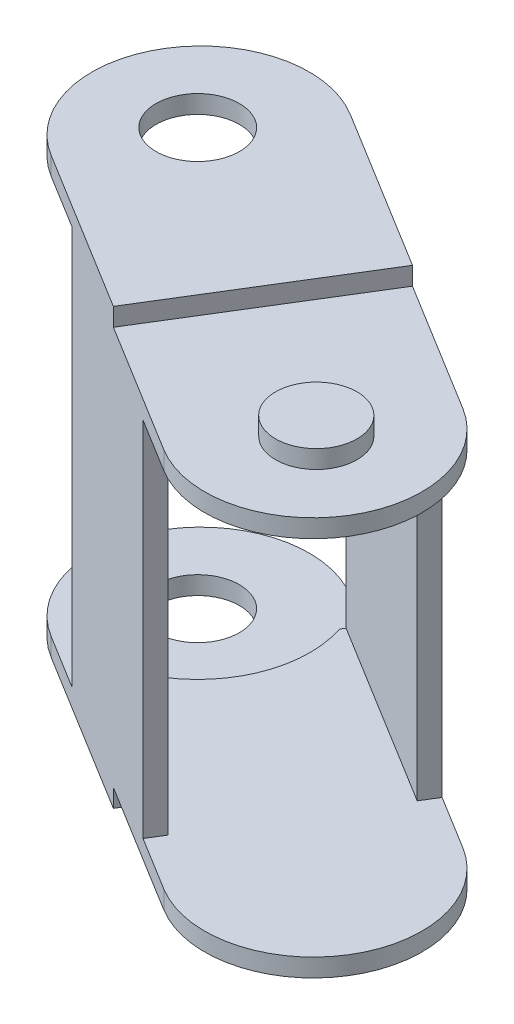
ISO-10303-21;
HEADER;
FILE_DESCRIPTION(('STEP AP214'),'2;1');
FILE_NAME('part.step','',(''),(''),'','','');
FILE_SCHEMA(('AUTOMOTIVE_DESIGN { 1 0 10303 214 1 1 1 1 }'));
ENDSEC;
DATA;
#1=APPLICATION_CONTEXT('core data for automotive mechanical design processes');
#2=APPLICATION_PROTOCOL_DEFINITION('international standard','automotive_design',2000,#1);
#3=PRODUCT_CONTEXT('',#1,'mechanical');
#4=PRODUCT('Part','Part','',(#3));
#5=PRODUCT_RELATED_PRODUCT_CATEGORY('part','',(#4));
#6=PRODUCT_DEFINITION_FORMATION('','',#4);
#7=PRODUCT_DEFINITION_CONTEXT('part definition',#1,'design');
#8=PRODUCT_DEFINITION('design','',#6,#7);
#9=PRODUCT_DEFINITION_SHAPE('','',#8);
#10=(LENGTH_UNIT() NAMED_UNIT(*) SI_UNIT(.MILLI.,.METRE.));
#11=(NAMED_UNIT(*) PLANE_ANGLE_UNIT() SI_UNIT($,.RADIAN.));
#12=(NAMED_UNIT(*) SI_UNIT($,.STERADIAN.) SOLID_ANGLE_UNIT());
#13=UNCERTAINTY_MEASURE_WITH_UNIT(LENGTH_MEASURE(1.E-05),#10,'distance_accuracy_value','');
#14=(GEOMETRIC_REPRESENTATION_CONTEXT(3) GLOBAL_UNCERTAINTY_ASSIGNED_CONTEXT((#13)) GLOBAL_UNIT_ASSIGNED_CONTEXT((#10,
#11,#12)) REPRESENTATION_CONTEXT('',''));
#15=CARTESIAN_POINT('',(0.,0.,0.));
#16=DIRECTION('',(0.,0.,1.));
#17=DIRECTION('',(1.,0.,0.));
#18=AXIS2_PLACEMENT_3D('',#15,#16,#17);
#19=CARTESIAN_POINT('',(-542.9529281263,21.5,74.6286141701));
#20=DIRECTION('',(0.,1.,0.));
#21=DIRECTION('',(0.851554736969907,0.,0.524265705481593));
#22=AXIS2_PLACEMENT_3D('',#19,#20,#21);
#23=CYLINDRICAL_SURFACE('',#22,2.25);
#24=CARTESIAN_POINT('',(-542.9529281263,21.,74.6286141701));
#25=DIRECTION('',(0.,1.,0.));
#26=DIRECTION('',(0.85155473696992,0.,0.524265705481572));
#27=AXIS2_PLACEMENT_3D('',#24,#25,#26);
#28=CIRCLE('',#27,2.25);
#29=CARTESIAN_POINT('',(-541.036929968118,21.,75.8082120074335));
#30=VERTEX_POINT('',#29);
#31=EDGE_CURVE('E205',#30,#30,#28,.F.);
#32=ORIENTED_EDGE('',*,*,#31,.F.);
#33=EDGE_LOOP('',(#32));
#34=FACE_BOUND('',#33,.T.);
#35=CARTESIAN_POINT('',(-542.9529281263,22.,74.6286141701));
#36=DIRECTION('',(0.,-1.,0.));
#37=DIRECTION('',(-0.85155473696992,0.,-0.524265705481572));
#38=AXIS2_PLACEMENT_3D('',#35,#36,#37);
#39=CIRCLE('',#38,2.25);
#40=CARTESIAN_POINT('',(-544.868926284482,22.,73.4490163327665));
#41=VERTEX_POINT('',#40);
#42=EDGE_CURVE('E202',#41,#41,#39,.F.);
#43=ORIENTED_EDGE('',*,*,#42,.F.);
#44=EDGE_LOOP('',(#43));
#45=FACE_BOUND('',#44,.T.);
#46=ADVANCED_FACE('F17',(#34,#45),#23,.T.);
#47=CARTESIAN_POINT('',(-547.471326526122,21.,64.80089439866));
#48=DIRECTION('',(0.,1.,0.));
#49=DIRECTION('',(-0.524265705481499,0.,0.851554736969965));
#50=AXIS2_PLACEMENT_3D('',#47,#48,#49);
#51=PLANE('',#50);
#52=CARTESIAN_POINT('',(-543.378705494923,21.,74.366481317392));
#53=DIRECTION('',(0.,1.,0.));
#54=DIRECTION('',(0.851554736978753,0.,0.524265705467226));
#55=AXIS2_PLACEMENT_3D('',#52,#53,#54);
#56=CIRCLE('',#55,6.);
#57=CARTESIAN_POINT('',(-540.233111262012,21.,69.257152895585));
#58=VERTEX_POINT('',#57);
#59=CARTESIAN_POINT('',(-546.524299727748,21.,79.475809739117));
#60=VERTEX_POINT('',#59);
#61=EDGE_CURVE('E189',#58,#60,#56,.F.);
#62=ORIENTED_EDGE('',*,*,#61,.F.);
#63=DIRECTION('',(-0.851554736962008,0.,-0.524265705494424));
#64=VECTOR('',#63,1.);
#65=CARTESIAN_POINT('',(-540.233111262006,21.,69.257152895576));
#66=LINE('',#65,#64);
#67=CARTESIAN_POINT('',(-547.471326526234,21.,64.800894398842));
#68=VERTEX_POINT('',#67);
#69=EDGE_CURVE('E177',#68,#58,#66,.F.);
#70=ORIENTED_EDGE('',*,*,#69,.F.);
#71=DIRECTION('',(-0.524265705481501,0.,0.851554736969963));
#72=VECTOR('',#71,1.);
#73=CARTESIAN_POINT('',(-547.471326526234,21.,64.800894398842));
#74=LINE('',#73,#72);
#75=CARTESIAN_POINT('',(-553.762514991925,21.,75.01955124234));
#76=VERTEX_POINT('',#75);
#77=EDGE_CURVE('E188',#76,#68,#74,.F.);
#78=ORIENTED_EDGE('',*,*,#77,.F.);
#79=DIRECTION('',(0.851554736958056,0.,0.524265705500843));
#80=VECTOR('',#79,1.);
#81=CARTESIAN_POINT('',(-553.762514991925,21.,75.01955124234));
#82=LINE('',#81,#80);
#83=EDGE_CURVE('E201',#60,#76,#82,.F.);
#84=ORIENTED_EDGE('',*,*,#83,.F.);
#85=EDGE_LOOP('',(#62,#70,#78,#84));
#86=FACE_BOUND('',#85,.T.);
#87=ORIENTED_EDGE('',*,*,#31,.T.);
#88=EDGE_LOOP('',(#87));
#89=FACE_BOUND('',#88,.T.);
#90=ADVANCED_FACE('F199',(#86,#89),#51,.T.);
#91=CARTESIAN_POINT('',(-546.080085144941,22.,75.416278455891));
#92=DIRECTION('',(0.,1.,0.));
#93=DIRECTION('',(0.851554736969965,0.,0.524265705481499));
#94=AXIS2_PLACEMENT_3D('',#91,#92,#93);
#95=PLANE('',#94);
#96=ORIENTED_EDGE('',*,*,#42,.T.);
#97=EDGE_LOOP('',(#96));
#98=FACE_BOUND('',#97,.T.);
#99=ADVANCED_FACE('F629',(#98),#95,.T.);
#100=CARTESIAN_POINT('',(-543.378705494818,-2.,74.366481317222));
#101=DIRECTION('',(0.,1.,0.));
#102=DIRECTION('',(-0.524265705480852,0.,0.851554736970363));
#103=AXIS2_PLACEMENT_3D('',#100,#101,#102);
#104=CYLINDRICAL_SURFACE('',#103,6.);
#105=DIRECTION('',(1.7735E-11,-1.,1.0914E-11));
#106=VECTOR('',#105,1.);
#107=CARTESIAN_POINT('',(-546.524299727703,21.,79.475809739044));
#108=LINE('',#107,#106);
#109=CARTESIAN_POINT('',(-546.524299727685,20.,79.475809739055));
#110=VERTEX_POINT('',#109);
#111=EDGE_CURVE('E217',#110,#60,#108,.F.);
#112=ORIENTED_EDGE('',*,*,#111,.F.);
#113=CARTESIAN_POINT('',(-543.378705494818,20.,74.366481317222));
#114=DIRECTION('',(0.,1.,0.));
#115=DIRECTION('',(-0.52426570547789,0.,0.851554736972187));
#116=AXIS2_PLACEMENT_3D('',#113,#114,#115);
#117=CIRCLE('',#116,6.);
#118=CARTESIAN_POINT('',(-540.233111262026,20.,69.257152895577));
#119=VERTEX_POINT('',#118);
#120=EDGE_CURVE('E196',#110,#119,#117,.T.);
#121=ORIENTED_EDGE('',*,*,#120,.T.);
#122=DIRECTION('',(1.3529E-11,1.,8.313E-12));
#123=VECTOR('',#122,1.);
#124=CARTESIAN_POINT('',(-540.233111262026,20.,69.257152895577));
#125=LINE('',#124,#123);
#126=EDGE_CURVE('E181',#119,#58,#125,.T.);
#127=ORIENTED_EDGE('',*,*,#126,.T.);
#128=ORIENTED_EDGE('',*,*,#61,.T.);
#129=EDGE_LOOP('',(#112,#121,#127,#128));
#130=FACE_BOUND('',#129,.T.);
#131=ADVANCED_FACE('F195',(#130),#104,.T.);
#132=CARTESIAN_POINT('',(-540.233111261896,-2.,69.25715289554));
#133=DIRECTION('',(0.524265705481499,0.,-0.851554736969965));
#134=DIRECTION('',(-0.851554736969965,0.,-0.524265705481499));
#135=AXIS2_PLACEMENT_3D('',#132,#133,#134);
#136=PLANE('',#135);
#137=DIRECTION('',(0.,-1.,0.));
#138=VECTOR('',#137,1.);
#139=CARTESIAN_POINT('',(-547.471326526255,22.,64.800894398877));
#140=LINE('',#139,#138);
#141=CARTESIAN_POINT('',(-547.471326526255,22.,64.800894398877));
#142=VERTEX_POINT('',#141);
#143=EDGE_CURVE('E184',#142,#68,#140,.T.);
#144=ORIENTED_EDGE('',*,*,#143,.T.);
#145=ORIENTED_EDGE('',*,*,#69,.T.);
#146=ORIENTED_EDGE('',*,*,#126,.F.);
#147=DIRECTION('',(-0.851554736969965,0.,-0.524265705481499));
#148=VECTOR('',#147,1.);
#149=CARTESIAN_POINT('',(-540.233111261973,20.,69.257152895492));
#150=LINE('',#149,#148);
#151=CARTESIAN_POINT('',(-543.2135528414,20.,67.422222926287));
#152=VERTEX_POINT('',#151);
#153=EDGE_CURVE('E229',#119,#152,#150,.T.);
#154=ORIENTED_EDGE('',*,*,#153,.T.);
#155=DIRECTION('',(0.,-1.,0.));
#156=VECTOR('',#155,1.);
#157=CARTESIAN_POINT('',(-543.2135528414,20.,67.422222926287));
#158=LINE('',#157,#156);
#159=CARTESIAN_POINT('',(-543.2135528414,0.,67.422222926287));
#160=VERTEX_POINT('',#159);
#161=EDGE_CURVE('E233',#152,#160,#158,.T.);
#162=ORIENTED_EDGE('',*,*,#161,.T.);
#163=DIRECTION('',(0.851554736969965,0.,0.524265705481498));
#164=VECTOR('',#163,1.);
#165=CARTESIAN_POINT('',(-543.2135528414,0.,67.422222926287));
#166=LINE('',#165,#164);
#167=CARTESIAN_POINT('',(-540.23311126196,0.,69.2571528955));
#168=VERTEX_POINT('',#167);
#169=EDGE_CURVE('E238',#160,#168,#166,.T.);
#170=ORIENTED_EDGE('',*,*,#169,.T.);
#171=DIRECTION('',(3.752E-12,-1.,2.302E-12));
#172=VECTOR('',#171,1.);
#173=CARTESIAN_POINT('',(-540.23311126196,0.,69.2571528955));
#174=LINE('',#173,#172);
#175=CARTESIAN_POINT('',(-540.233111261956,-1.,69.257152895503));
#176=VERTEX_POINT('',#175);
#177=EDGE_CURVE('E243',#176,#168,#174,.F.);
#178=ORIENTED_EDGE('',*,*,#177,.F.);
#179=DIRECTION('',(-0.851554736969964,0.,-0.524265705481501));
#180=VECTOR('',#179,1.);
#181=CARTESIAN_POINT('',(-540.233111261956,-1.,69.257152895503));
#182=LINE('',#181,#180);
#183=CARTESIAN_POINT('',(-547.471326526255,-1.,64.800894398876));
#184=VERTEX_POINT('',#183);
#185=EDGE_CURVE('E247',#176,#184,#182,.T.);
#186=ORIENTED_EDGE('',*,*,#185,.T.);
#187=DIRECTION('',(-1.14E-13,-1.,0.));
#188=VECTOR('',#187,1.);
#189=CARTESIAN_POINT('',(-547.471326526255,-1.,64.800894398876));
#190=LINE('',#189,#188);
#191=CARTESIAN_POINT('',(-547.471326526255,-2.,64.800894398876));
#192=VERTEX_POINT('',#191);
#193=EDGE_CURVE('E252',#184,#192,#190,.T.);
#194=ORIENTED_EDGE('',*,*,#193,.T.);
#195=DIRECTION('',(-0.851554736969965,0.,-0.524265705481499));
#196=VECTOR('',#195,1.);
#197=CARTESIAN_POINT('',(-547.471326526255,-2.,64.800894398876));
#198=LINE('',#197,#196);
#199=CARTESIAN_POINT('',(-556.412651264325,-2.,59.296104491391));
#200=VERTEX_POINT('',#199);
#201=EDGE_CURVE('E257',#192,#200,#198,.T.);
#202=ORIENTED_EDGE('',*,*,#201,.T.);
#203=DIRECTION('',(0.,1.,0.));
#204=VECTOR('',#203,1.);
#205=CARTESIAN_POINT('',(-556.412651264325,-2.,59.296104491391));
#206=LINE('',#205,#204);
#207=CARTESIAN_POINT('',(-556.412651264325,-1.,59.296104491391));
#208=VERTEX_POINT('',#207);
#209=EDGE_CURVE('E262',#200,#208,#206,.T.);
#210=ORIENTED_EDGE('',*,*,#209,.T.);
#211=DIRECTION('',(0.851554736969968,0.,0.524265705481494));
#212=VECTOR('',#211,1.);
#213=CARTESIAN_POINT('',(-556.412651264325,-1.,59.296104491391));
#214=LINE('',#213,#212);
#215=CARTESIAN_POINT('',(-553.432209685043,-1.,61.131034460507));
#216=VERTEX_POINT('',#215);
#217=EDGE_CURVE('E267',#208,#216,#214,.T.);
#218=ORIENTED_EDGE('',*,*,#217,.T.);
#219=DIRECTION('',(0.,1.,0.));
#220=VECTOR('',#219,1.);
#221=CARTESIAN_POINT('',(-553.432209685043,-1.,61.131034460507));
#222=LINE('',#221,#220);
#223=CARTESIAN_POINT('',(-553.432209685043,21.,61.131034460507));
#224=VERTEX_POINT('',#223);
#225=EDGE_CURVE('E272',#216,#224,#222,.T.);
#226=ORIENTED_EDGE('',*,*,#225,.T.);
#227=DIRECTION('',(-0.851554736969968,0.,-0.524265705481494));
#228=VECTOR('',#227,1.);
#229=CARTESIAN_POINT('',(-553.432209685043,21.,61.131034460507));
#230=LINE('',#229,#228);
#231=CARTESIAN_POINT('',(-556.412651264325,21.,59.296104491391));
#232=VERTEX_POINT('',#231);
#233=EDGE_CURVE('E277',#224,#232,#230,.T.);
#234=ORIENTED_EDGE('',*,*,#233,.T.);
#235=DIRECTION('',(0.,1.,0.));
#236=VECTOR('',#235,1.);
#237=CARTESIAN_POINT('',(-556.412651264325,21.,59.296104491391));
#238=LINE('',#237,#236);
#239=CARTESIAN_POINT('',(-556.412651264325,22.,59.296104491391));
#240=VERTEX_POINT('',#239);
#241=EDGE_CURVE('E282',#232,#240,#238,.T.);
#242=ORIENTED_EDGE('',*,*,#241,.T.);
#243=DIRECTION('',(0.851554736969965,0.,0.524265705481499));
#244=VECTOR('',#243,1.);
#245=CARTESIAN_POINT('',(-556.412651264325,22.,59.296104491391));
#246=LINE('',#245,#244);
#247=EDGE_CURVE('E287',#240,#142,#246,.T.);
#248=ORIENTED_EDGE('',*,*,#247,.T.);
#249=EDGE_LOOP('',(#144,#145,#146,#154,#162,#170,#178,#186,#194,#202,#210,#218,#226,#234,#242,#248));
#250=FACE_BOUND('',#249,.T.);
#251=ADVANCED_FACE('F179',(#250),#136,.T.);
#252=CARTESIAN_POINT('',(-553.762514991926,21.,75.019551242342));
#253=DIRECTION('',(0.851554736969965,0.,0.524265705481499));
#254=DIRECTION('',(0.524265705481499,0.,-0.851554736969965));
#255=AXIS2_PLACEMENT_3D('',#252,#253,#254);
#256=PLANE('',#255);
#257=DIRECTION('',(-0.524265705481503,0.,0.851554736969962));
#258=VECTOR('',#257,1.);
#259=CARTESIAN_POINT('',(-547.471326526222,22.,64.800894398822));
#260=LINE('',#259,#258);
#261=CARTESIAN_POINT('',(-553.762514991926,22.,75.019551242342));
#262=VERTEX_POINT('',#261);
#263=EDGE_CURVE('E291',#262,#142,#260,.F.);
#264=ORIENTED_EDGE('',*,*,#263,.F.);
#265=DIRECTION('',(1.364E-12,-1.,-2.117E-12));
#266=VECTOR('',#265,1.);
#267=CARTESIAN_POINT('',(-553.762514991926,22.,75.019551242342));
#268=LINE('',#267,#266);
#269=EDGE_CURVE('E295',#76,#262,#268,.F.);
#270=ORIENTED_EDGE('',*,*,#269,.F.);
#271=ORIENTED_EDGE('',*,*,#77,.T.);
#272=ORIENTED_EDGE('',*,*,#143,.F.);
#273=EDGE_LOOP('',(#264,#270,#271,#272));
#274=FACE_BOUND('',#273,.T.);
#275=ADVANCED_FACE('F613',(#274),#256,.T.);
#276=CARTESIAN_POINT('',(-562.703839730104,-2.,69.514761335031));
#277=DIRECTION('',(-0.524265705481499,0.,0.851554736969965));
#278=DIRECTION('',(0.851554736969965,0.,0.524265705481499));
#279=AXIS2_PLACEMENT_3D('',#276,#277,#278);
#280=PLANE('',#279);
#281=ORIENTED_EDGE('',*,*,#83,.T.);
#282=ORIENTED_EDGE('',*,*,#269,.T.);
#283=DIRECTION('',(-0.851554736969966,0.,-0.524265705481497));
#284=VECTOR('',#283,1.);
#285=CARTESIAN_POINT('',(-553.762514992033,22.,75.019551242516));
#286=LINE('',#285,#284);
#287=CARTESIAN_POINT('',(-562.703839730103,22.,69.514761335031));
#288=VERTEX_POINT('',#287);
#289=EDGE_CURVE('E300',#262,#288,#286,.T.);
#290=ORIENTED_EDGE('',*,*,#289,.T.);
#291=DIRECTION('',(0.,-1.,0.));
#292=VECTOR('',#291,1.);
#293=CARTESIAN_POINT('',(-562.703839730103,22.,69.514761335031));
#294=LINE('',#293,#292);
#295=CARTESIAN_POINT('',(-562.703839730103,21.,69.514761335031));
#296=VERTEX_POINT('',#295);
#297=EDGE_CURVE('E305',#296,#288,#294,.F.);
#298=ORIENTED_EDGE('',*,*,#297,.F.);
#299=DIRECTION('',(0.851554736969963,0.,0.524265705481502));
#300=VECTOR('',#299,1.);
#301=CARTESIAN_POINT('',(-562.703839730103,21.,69.514761335031));
#302=LINE('',#301,#300);
#303=CARTESIAN_POINT('',(-559.723398150821,21.,71.349691304147));
#304=VERTEX_POINT('',#303);
#305=EDGE_CURVE('E310',#296,#304,#302,.T.);
#306=ORIENTED_EDGE('',*,*,#305,.T.);
#307=DIRECTION('',(0.,-1.,0.));
#308=VECTOR('',#307,1.);
#309=CARTESIAN_POINT('',(-559.723398150821,21.,71.349691304147));
#310=LINE('',#309,#308);
#311=CARTESIAN_POINT('',(-559.723398150821,-1.,71.349691304147));
#312=VERTEX_POINT('',#311);
#313=EDGE_CURVE('E315',#304,#312,#310,.T.);
#314=ORIENTED_EDGE('',*,*,#313,.T.);
#315=DIRECTION('',(-0.851554736969961,0.,-0.524265705481505));
#316=VECTOR('',#315,1.);
#317=CARTESIAN_POINT('',(-559.723398150821,-1.,71.349691304147));
#318=LINE('',#317,#316);
#319=CARTESIAN_POINT('',(-562.703839730103,-1.,69.514761335031));
#320=VERTEX_POINT('',#319);
#321=EDGE_CURVE('E320',#312,#320,#318,.T.);
#322=ORIENTED_EDGE('',*,*,#321,.T.);
#323=DIRECTION('',(-1.14E-13,-1.,0.));
#324=VECTOR('',#323,1.);
#325=CARTESIAN_POINT('',(-562.703839730103,-1.,69.514761335031));
#326=LINE('',#325,#324);
#327=CARTESIAN_POINT('',(-562.703839730104,-2.,69.514761335031));
#328=VERTEX_POINT('',#327);
#329=EDGE_CURVE('E325',#328,#320,#326,.F.);
#330=ORIENTED_EDGE('',*,*,#329,.F.);
#331=DIRECTION('',(0.851554736969965,0.,0.524265705481499));
#332=VECTOR('',#331,1.);
#333=CARTESIAN_POINT('',(-562.703839730104,-2.,69.514761335031));
#334=LINE('',#333,#332);
#335=CARTESIAN_POINT('',(-553.762514992033,-2.,75.019551242516));
#336=VERTEX_POINT('',#335);
#337=EDGE_CURVE('E330',#328,#336,#334,.T.);
#338=ORIENTED_EDGE('',*,*,#337,.T.);
#339=DIRECTION('',(2.27E-13,1.,1.42E-13));
#340=VECTOR('',#339,1.);
#341=CARTESIAN_POINT('',(-553.762514992033,-2.,75.019551242516));
#342=LINE('',#341,#340);
#343=CARTESIAN_POINT('',(-553.762514992033,-1.,75.019551242516));
#344=VERTEX_POINT('',#343);
#345=EDGE_CURVE('E335',#336,#344,#342,.T.);
#346=ORIENTED_EDGE('',*,*,#345,.T.);
#347=DIRECTION('',(0.851554736969968,0.,0.524265705481494));
#348=VECTOR('',#347,1.);
#349=CARTESIAN_POINT('',(-553.762514992033,-1.,75.019551242516));
#350=LINE('',#349,#348);
#351=CARTESIAN_POINT('',(-546.524299727755,-1.,79.475809739129));
#352=VERTEX_POINT('',#351);
#353=EDGE_CURVE('E340',#344,#352,#350,.T.);
#354=ORIENTED_EDGE('',*,*,#353,.T.);
#355=DIRECTION('',(4.093E-12,1.,2.572E-12));
#356=VECTOR('',#355,1.);
#357=CARTESIAN_POINT('',(-546.524299727755,-1.,79.475809739129));
#358=LINE('',#357,#356);
#359=CARTESIAN_POINT('',(-546.524299727751,0.,79.475809739132));
#360=VERTEX_POINT('',#359);
#361=EDGE_CURVE('E345',#352,#360,#358,.T.);
#362=ORIENTED_EDGE('',*,*,#361,.T.);
#363=DIRECTION('',(-0.851554736969967,0.,-0.524265705481496));
#364=VECTOR('',#363,1.);
#365=CARTESIAN_POINT('',(-546.524299727751,0.,79.475809739132));
#366=LINE('',#365,#364);
#367=CARTESIAN_POINT('',(-549.504741307178,0.,77.640879769927));
#368=VERTEX_POINT('',#367);
#369=EDGE_CURVE('E350',#360,#368,#366,.T.);
#370=ORIENTED_EDGE('',*,*,#369,.T.);
#371=DIRECTION('',(0.,1.,0.));
#372=VECTOR('',#371,1.);
#373=CARTESIAN_POINT('',(-549.504741307178,0.,77.640879769927));
#374=LINE('',#373,#372);
#375=CARTESIAN_POINT('',(-549.504741307178,20.,77.640879769927));
#376=VERTEX_POINT('',#375);
#377=EDGE_CURVE('E355',#368,#376,#374,.T.);
#378=ORIENTED_EDGE('',*,*,#377,.T.);
#379=DIRECTION('',(0.85155473696996,0.,0.524265705481507));
#380=VECTOR('',#379,1.);
#381=CARTESIAN_POINT('',(-549.504741307178,20.,77.640879769927));
#382=LINE('',#381,#380);
#383=EDGE_CURVE('E360',#376,#110,#382,.T.);
#384=ORIENTED_EDGE('',*,*,#383,.T.);
#385=ORIENTED_EDGE('',*,*,#111,.T.);
#386=EDGE_LOOP('',(#281,#282,#290,#298,#306,#314,#322,#330,#338,#346,#354,#362,#370,#378,#384,#385));
#387=FACE_BOUND('',#386,.T.);
#388=ADVANCED_FACE('F555',(#387),#280,.T.);
#389=CARTESIAN_POINT('',(-559.723398150821,20.,71.349691304147));
#390=DIRECTION('',(0.,-1.,0.));
#391=DIRECTION('',(0.524265705481499,0.,-0.851554736969965));
#392=AXIS2_PLACEMENT_3D('',#389,#390,#391);
#393=PLANE('',#392);
#394=CARTESIAN_POINT('',(-559.984022865699,20.,64.14330006047));
#395=DIRECTION('',(0.,1.,0.));
#396=DIRECTION('',(0.851554736969928,0.,0.524265705481559));
#397=AXIS2_PLACEMENT_3D('',#394,#395,#396);
#398=CIRCLE('',#397,6.2);
#399=CARTESIAN_POINT('',(-559.061296549737,20.,70.27425236381));
#400=VERTEX_POINT('',#399);
#401=CARTESIAN_POINT('',(-554.094311286126,20.,62.206473400844));
#402=VERTEX_POINT('',#401);
#403=EDGE_CURVE('E365',#400,#402,#398,.T.);
#404=ORIENTED_EDGE('',*,*,#403,.T.);
#405=DIRECTION('',(0.524265705481445,0.,-0.851554736969998));
#406=VECTOR('',#405,1.);
#407=CARTESIAN_POINT('',(-554.094311286126,20.,62.206473400844));
#408=LINE('',#407,#406);
#409=CARTESIAN_POINT('',(-553.956475390524,20.,61.982589197477));
#410=VERTEX_POINT('',#409);
#411=EDGE_CURVE('E370',#402,#410,#408,.T.);
#412=ORIENTED_EDGE('',*,*,#411,.T.);
#413=DIRECTION('',(0.851554736969963,0.,0.524265705481503));
#414=VECTOR('',#413,1.);
#415=CARTESIAN_POINT('',(-553.956475390524,20.,61.982589197477));
#416=LINE('',#415,#414);
#417=CARTESIAN_POINT('',(-543.737818546881,20.,68.273777663257));
#418=VERTEX_POINT('',#417);
#419=EDGE_CURVE('E375',#418,#410,#416,.F.);
#420=ORIENTED_EDGE('',*,*,#419,.F.);
#421=DIRECTION('',(0.524265705481263,0.,-0.85155473697011));
#422=VECTOR('',#421,1.);
#423=CARTESIAN_POINT('',(-543.737818546881,20.,68.273777663257));
#424=LINE('',#423,#422);
#425=EDGE_CURVE('E379',#152,#418,#424,.F.);
#426=ORIENTED_EDGE('',*,*,#425,.F.);
#427=ORIENTED_EDGE('',*,*,#153,.F.);
#428=ORIENTED_EDGE('',*,*,#120,.F.);
#429=ORIENTED_EDGE('',*,*,#383,.F.);
#430=DIRECTION('',(0.524265705481574,0.,-0.851554736969919));
#431=VECTOR('',#430,1.);
#432=CARTESIAN_POINT('',(-549.504741307171,20.,77.640879769916));
#433=LINE('',#432,#431);
#434=CARTESIAN_POINT('',(-548.980475601696,20.,76.789325032957));
#435=VERTEX_POINT('',#434);
#436=EDGE_CURVE('E384',#435,#376,#433,.F.);
#437=ORIENTED_EDGE('',*,*,#436,.F.);
#438=DIRECTION('',(-0.85155473696997,0.,-0.524265705481491));
#439=VECTOR('',#438,1.);
#440=CARTESIAN_POINT('',(-548.980475601696,20.,76.789325032957));
#441=LINE('',#440,#439);
#442=CARTESIAN_POINT('',(-559.199132445339,20.,70.498136567177));
#443=VERTEX_POINT('',#442);
#444=EDGE_CURVE('E388',#443,#435,#441,.F.);
#445=ORIENTED_EDGE('',*,*,#444,.F.);
#446=DIRECTION('',(0.524265705482434,0.,-0.851554736969389));
#447=VECTOR('',#446,1.);
#448=CARTESIAN_POINT('',(-559.199132445339,20.,70.498136567177));
#449=LINE('',#448,#447);
#450=EDGE_CURVE('E392',#443,#400,#449,.T.);
#451=ORIENTED_EDGE('',*,*,#450,.T.);
#452=EDGE_LOOP('',(#404,#412,#420,#426,#427,#428,#429,#437,#445,#451));
#453=FACE_BOUND('',#452,.T.);
#454=ADVANCED_FACE('F557',(#453),#393,.T.);
#455=CARTESIAN_POINT('',(-543.737818546881,20.,68.273777663257));
#456=DIRECTION('',(0.851554736969965,0.,0.524265705481499));
#457=DIRECTION('',(0.,-1.,0.));
#458=AXIS2_PLACEMENT_3D('',#455,#456,#457);
#459=PLANE('',#458);
#460=DIRECTION('',(0.,-1.,0.));
#461=VECTOR('',#460,1.);
#462=CARTESIAN_POINT('',(-543.737818546881,20.,68.273777663257));
#463=LINE('',#462,#461);
#464=CARTESIAN_POINT('',(-543.737818546881,0.,68.273777663257));
#465=VERTEX_POINT('',#464);
#466=EDGE_CURVE('E397',#465,#418,#463,.F.);
#467=ORIENTED_EDGE('',*,*,#466,.F.);
#468=DIRECTION('',(0.524265705481557,0.,-0.851554736969929));
#469=VECTOR('',#468,1.);
#470=CARTESIAN_POINT('',(-543.737818546881,0.,68.273777663257));
#471=LINE('',#470,#469);
#472=EDGE_CURVE('E401',#465,#160,#471,.T.);
#473=ORIENTED_EDGE('',*,*,#472,.T.);
#474=ORIENTED_EDGE('',*,*,#161,.F.);
#475=ORIENTED_EDGE('',*,*,#425,.T.);
#476=EDGE_LOOP('',(#467,#473,#474,#475));
#477=FACE_BOUND('',#476,.T.);
#478=ADVANCED_FACE('F563',(#477),#459,.T.);
#479=CARTESIAN_POINT('',(-559.723398150821,0.,71.349691304147));
#480=DIRECTION('',(0.,1.,0.));
#481=DIRECTION('',(0.851554736969965,0.,0.524265705481499));
#482=AXIS2_PLACEMENT_3D('',#479,#480,#481);
#483=PLANE('',#482);
#484=CARTESIAN_POINT('',(-559.984022865699,0.,64.14330006047));
#485=DIRECTION('',(0.,-1.,0.));
#486=DIRECTION('',(0.851554736969928,0.,0.524265705481559));
#487=AXIS2_PLACEMENT_3D('',#484,#485,#486);
#488=CIRCLE('',#487,6.2);
#489=CARTESIAN_POINT('',(-554.094311286126,0.,62.206473400844));
#490=VERTEX_POINT('',#489);
#491=CARTESIAN_POINT('',(-559.061296549737,0.,70.27425236381));
#492=VERTEX_POINT('',#491);
#493=EDGE_CURVE('E406',#490,#492,#488,.T.);
#494=ORIENTED_EDGE('',*,*,#493,.T.);
#495=DIRECTION('',(-0.524265705481735,0.,0.85155473696982));
#496=VECTOR('',#495,1.);
#497=CARTESIAN_POINT('',(-559.061296549737,0.,70.27425236381));
#498=LINE('',#497,#496);
#499=CARTESIAN_POINT('',(-559.199132445339,0.,70.498136567177));
#500=VERTEX_POINT('',#499);
#501=EDGE_CURVE('E411',#492,#500,#498,.T.);
#502=ORIENTED_EDGE('',*,*,#501,.T.);
#503=DIRECTION('',(0.851554736969964,0.,0.524265705481501));
#504=VECTOR('',#503,1.);
#505=CARTESIAN_POINT('',(-559.199132445339,0.,70.498136567177));
#506=LINE('',#505,#504);
#507=CARTESIAN_POINT('',(-548.980475601696,0.,76.789325032957));
#508=VERTEX_POINT('',#507);
#509=EDGE_CURVE('E416',#508,#500,#506,.F.);
#510=ORIENTED_EDGE('',*,*,#509,.F.);
#511=DIRECTION('',(-0.524265705481861,0.,0.851554736969742));
#512=VECTOR('',#511,1.);
#513=CARTESIAN_POINT('',(-548.980475601696,0.,76.789325032957));
#514=LINE('',#513,#512);
#515=EDGE_CURVE('E420',#368,#508,#514,.F.);
#516=ORIENTED_EDGE('',*,*,#515,.F.);
#517=ORIENTED_EDGE('',*,*,#369,.F.);
#518=CARTESIAN_POINT('',(-543.378705494923,0.,74.366481317392));
#519=DIRECTION('',(0.,1.,0.));
#520=DIRECTION('',(0.851554736978738,0.,0.524265705467249));
#521=AXIS2_PLACEMENT_3D('',#518,#519,#520);
#522=CIRCLE('',#521,6.);
#523=EDGE_CURVE('E425',#168,#360,#522,.F.);
#524=ORIENTED_EDGE('',*,*,#523,.F.);
#525=ORIENTED_EDGE('',*,*,#169,.F.);
#526=ORIENTED_EDGE('',*,*,#472,.F.);
#527=DIRECTION('',(-0.85155473696997,0.,-0.524265705481491));
#528=VECTOR('',#527,1.);
#529=CARTESIAN_POINT('',(-543.737818546881,0.,68.273777663257));
#530=LINE('',#529,#528);
#531=CARTESIAN_POINT('',(-553.956475390524,0.,61.982589197477));
#532=VERTEX_POINT('',#531);
#533=EDGE_CURVE('E429',#532,#465,#530,.F.);
#534=ORIENTED_EDGE('',*,*,#533,.F.);
#535=DIRECTION('',(-0.524265705481144,0.,0.851554736970184));
#536=VECTOR('',#535,1.);
#537=CARTESIAN_POINT('',(-553.956475390524,0.,61.982589197477));
#538=LINE('',#537,#536);
#539=EDGE_CURVE('E433',#532,#490,#538,.T.);
#540=ORIENTED_EDGE('',*,*,#539,.T.);
#541=EDGE_LOOP('',(#494,#502,#510,#516,#517,#524,#525,#526,#534,#540));
#542=FACE_BOUND('',#541,.T.);
#543=ADVANCED_FACE('F549',(#542),#483,.T.);
#544=CARTESIAN_POINT('',(-543.378705494923,-2.,74.366481317392));
#545=DIRECTION('',(0.,1.,0.));
#546=DIRECTION('',(0.85155473697874,0.,0.524265705467246));
#547=AXIS2_PLACEMENT_3D('',#544,#545,#546);
#548=CYLINDRICAL_SURFACE('',#547,6.);
#549=ORIENTED_EDGE('',*,*,#177,.T.);
#550=ORIENTED_EDGE('',*,*,#523,.T.);
#551=ORIENTED_EDGE('',*,*,#361,.F.);
#552=CARTESIAN_POINT('',(-543.378705494818,-1.,74.366481317222));
#553=DIRECTION('',(0.,-1.,0.));
#554=DIRECTION('',(0.851554736961262,0.,0.524265705495636));
#555=AXIS2_PLACEMENT_3D('',#552,#553,#554);
#556=CIRCLE('',#555,6.);
#557=EDGE_CURVE('E438',#352,#176,#556,.F.);
#558=ORIENTED_EDGE('',*,*,#557,.T.);
#559=EDGE_LOOP('',(#549,#550,#551,#558));
#560=FACE_BOUND('',#559,.T.);
#561=ADVANCED_FACE('F570',(#560),#548,.T.);
#562=CARTESIAN_POINT('',(-553.762514992026,-1.,75.019551242504));
#563=DIRECTION('',(0.,-1.,0.));
#564=DIRECTION('',(0.524265705481499,0.,-0.851554736969965));
#565=AXIS2_PLACEMENT_3D('',#562,#563,#564);
#566=PLANE('',#565);
#567=ORIENTED_EDGE('',*,*,#557,.F.);
#568=ORIENTED_EDGE('',*,*,#353,.F.);
#569=DIRECTION('',(0.524265705481496,0.,-0.851554736969967));
#570=VECTOR('',#569,1.);
#571=CARTESIAN_POINT('',(-553.762514992012,-1.,75.019551242482));
#572=LINE('',#571,#570);
#573=EDGE_CURVE('E443',#344,#184,#572,.T.);
#574=ORIENTED_EDGE('',*,*,#573,.T.);
#575=ORIENTED_EDGE('',*,*,#185,.F.);
#576=EDGE_LOOP('',(#567,#568,#574,#575));
#577=FACE_BOUND('',#576,.T.);
#578=CARTESIAN_POINT('',(-542.9529281263,-1.,74.6286141701));
#579=DIRECTION('',(0.,1.,0.));
#580=DIRECTION('',(0.85155473696992,0.,0.524265705481572));
#581=AXIS2_PLACEMENT_3D('',#578,#579,#580);
#582=CIRCLE('',#581,2.25);
#583=CARTESIAN_POINT('',(-541.036929968118,-1.,75.8082120074335));
#584=VERTEX_POINT('',#583);
#585=EDGE_CURVE('E448',#584,#584,#582,.T.);
#586=ORIENTED_EDGE('',*,*,#585,.T.);
#587=EDGE_LOOP('',(#586));
#588=FACE_BOUND('',#587,.T.);
#589=ADVANCED_FACE('F574',(#577,#588),#566,.T.);
#590=CARTESIAN_POINT('',(-553.762514992013,-2.,75.019551242483));
#591=DIRECTION('',(0.851554736969965,0.,0.524265705481499));
#592=DIRECTION('',(0.524265705481499,0.,-0.851554736969965));
#593=AXIS2_PLACEMENT_3D('',#590,#591,#592);
#594=PLANE('',#593);
#595=ORIENTED_EDGE('',*,*,#573,.F.);
#596=ORIENTED_EDGE('',*,*,#345,.F.);
#597=DIRECTION('',(0.524265705481502,0.,-0.851554736969963));
#598=VECTOR('',#597,1.);
#599=CARTESIAN_POINT('',(-553.762514992013,-2.,75.019551242483));
#600=LINE('',#599,#598);
#601=EDGE_CURVE('E453',#192,#336,#600,.F.);
#602=ORIENTED_EDGE('',*,*,#601,.F.);
#603=ORIENTED_EDGE('',*,*,#193,.F.);
#604=EDGE_LOOP('',(#595,#596,#602,#603));
#605=FACE_BOUND('',#604,.T.);
#606=ADVANCED_FACE('F578',(#605),#594,.T.);
#607=CARTESIAN_POINT('',(-567.813168151818,-2.,66.369167102161));
#608=DIRECTION('',(0.,-1.,0.));
#609=DIRECTION('',(0.524265705481499,0.,-0.851554736969965));
#610=AXIS2_PLACEMENT_3D('',#607,#608,#609);
#611=PLANE('',#610);
#612=ORIENTED_EDGE('',*,*,#601,.T.);
#613=ORIENTED_EDGE('',*,*,#337,.F.);
#614=CARTESIAN_POINT('',(-559.558245497182,-2.,64.405432913348));
#615=DIRECTION('',(0.,-1.,0.));
#616=DIRECTION('',(-0.851554736961213,0.,-0.524265705495715));
#617=AXIS2_PLACEMENT_3D('',#614,#615,#616);
#618=CIRCLE('',#617,6.);
#619=EDGE_CURVE('E455',#200,#328,#618,.F.);
#620=ORIENTED_EDGE('',*,*,#619,.F.);
#621=ORIENTED_EDGE('',*,*,#201,.F.);
#622=EDGE_LOOP('',(#612,#613,#620,#621));
#623=FACE_BOUND('',#622,.T.);
#624=CARTESIAN_POINT('',(-559.9840228654,-2.,64.14330006));
#625=DIRECTION('',(0.,1.,0.));
#626=DIRECTION('',(0.85155473696999,0.,0.524265705481459));
#627=AXIS2_PLACEMENT_3D('',#624,#625,#626);
#628=CIRCLE('',#627,2.3);
#629=CARTESIAN_POINT('',(-558.025446970369,-2.,65.3491111826074));
#630=VERTEX_POINT('',#629);
#631=EDGE_CURVE('E459',#630,#630,#628,.T.);
#632=ORIENTED_EDGE('',*,*,#631,.T.);
#633=EDGE_LOOP('',(#632));
#634=FACE_BOUND('',#633,.T.);
#635=ADVANCED_FACE('F581',(#623,#634),#611,.T.);
#636=CARTESIAN_POINT('',(-559.558245497182,-2.,64.405432913348));
#637=DIRECTION('',(0.,1.,0.));
#638=DIRECTION('',(0.524265705467409,0.,-0.85155473697864));
#639=AXIS2_PLACEMENT_3D('',#636,#637,#638);
#640=CYLINDRICAL_SURFACE('',#639,6.);
#641=ORIENTED_EDGE('',*,*,#209,.F.);
#642=ORIENTED_EDGE('',*,*,#619,.T.);
#643=ORIENTED_EDGE('',*,*,#329,.T.);
#644=CARTESIAN_POINT('',(-559.558245497077,-1.,64.405432913178));
#645=DIRECTION('',(0.,1.,0.));
#646=DIRECTION('',(-0.851554736978697,0.,-0.524265705467316));
#647=AXIS2_PLACEMENT_3D('',#644,#645,#646);
#648=CIRCLE('',#647,6.);
#649=EDGE_CURVE('E464',#320,#208,#648,.F.);
#650=ORIENTED_EDGE('',*,*,#649,.T.);
#651=EDGE_LOOP('',(#641,#642,#643,#650));
#652=FACE_BOUND('',#651,.T.);
#653=ADVANCED_FACE('F587',(#652),#640,.T.);
#654=CARTESIAN_POINT('',(-567.813168151793,-1.,66.369167102121));
#655=DIRECTION('',(0.,1.,0.));
#656=DIRECTION('',(0.851554736969965,0.,0.524265705481499));
#657=AXIS2_PLACEMENT_3D('',#654,#655,#656);
#658=PLANE('',#657);
#659=ORIENTED_EDGE('',*,*,#217,.F.);
#660=ORIENTED_EDGE('',*,*,#649,.F.);
#661=ORIENTED_EDGE('',*,*,#321,.F.);
#662=DIRECTION('',(0.524265705481773,0.,-0.851554736969797));
#663=VECTOR('',#662,1.);
#664=CARTESIAN_POINT('',(-559.723398150776,-1.,71.349691304074));
#665=LINE('',#664,#663);
#666=CARTESIAN_POINT('',(-559.061296549737,-1.,70.27425236381));
#667=VERTEX_POINT('',#666);
#668=EDGE_CURVE('E467',#667,#312,#665,.F.);
#669=ORIENTED_EDGE('',*,*,#668,.F.);
#670=CARTESIAN_POINT('',(-559.984022865699,-1.,64.14330006047));
#671=DIRECTION('',(0.,1.,0.));
#672=DIRECTION('',(0.851554736969928,0.,0.524265705481559));
#673=AXIS2_PLACEMENT_3D('',#670,#671,#672);
#674=CIRCLE('',#673,6.2);
#675=CARTESIAN_POINT('',(-554.094311286126,-1.,62.206473400844));
#676=VERTEX_POINT('',#675);
#677=EDGE_CURVE('E471',#676,#667,#674,.F.);
#678=ORIENTED_EDGE('',*,*,#677,.F.);
#679=DIRECTION('',(0.524265705481403,0.,-0.851554736970024));
#680=VECTOR('',#679,1.);
#681=CARTESIAN_POINT('',(-554.094311286126,-1.,62.206473400844));
#682=LINE('',#681,#680);
#683=EDGE_CURVE('E475',#216,#676,#682,.F.);
#684=ORIENTED_EDGE('',*,*,#683,.F.);
#685=EDGE_LOOP('',(#659,#660,#661,#669,#678,#684));
#686=FACE_BOUND('',#685,.T.);
#687=CARTESIAN_POINT('',(-559.9840228654,-1.,64.14330006));
#688=DIRECTION('',(0.,-1.,0.));
#689=DIRECTION('',(-0.851554736969954,0.,-0.524265705481516));
#690=AXIS2_PLACEMENT_3D('',#687,#688,#689);
#691=CIRCLE('',#690,2.3);
#692=CARTESIAN_POINT('',(-561.942598760431,-1.,62.9374889373925));
#693=VERTEX_POINT('',#692);
#694=EDGE_CURVE('E480',#693,#693,#691,.T.);
#695=ORIENTED_EDGE('',*,*,#694,.T.);
#696=EDGE_LOOP('',(#695));
#697=FACE_BOUND('',#696,.T.);
#698=ADVANCED_FACE('F590',(#686,#697),#658,.T.);
#699=CARTESIAN_POINT('',(-554.094311286126,-1.,62.206473400844));
#700=DIRECTION('',(-0.851554736969965,0.,-0.524265705481499));
#701=DIRECTION('',(0.,1.,0.));
#702=AXIS2_PLACEMENT_3D('',#699,#700,#701);
#703=PLANE('',#702);
#704=DIRECTION('',(0.,1.,0.));
#705=VECTOR('',#704,1.);
#706=CARTESIAN_POINT('',(-554.094311286126,20.,62.206473400844));
#707=LINE('',#706,#705);
#708=CARTESIAN_POINT('',(-554.094311286126,21.,62.206473400844));
#709=VERTEX_POINT('',#708);
#710=EDGE_CURVE('E485',#402,#709,#707,.T.);
#711=ORIENTED_EDGE('',*,*,#710,.T.);
#712=DIRECTION('',(0.524265705481519,0.,-0.851554736969953));
#713=VECTOR('',#712,1.);
#714=CARTESIAN_POINT('',(-554.094311286126,21.,62.206473400844));
#715=LINE('',#714,#713);
#716=EDGE_CURVE('E487',#709,#224,#715,.T.);
#717=ORIENTED_EDGE('',*,*,#716,.T.);
#718=ORIENTED_EDGE('',*,*,#225,.F.);
#719=ORIENTED_EDGE('',*,*,#683,.T.);
#720=DIRECTION('',(0.,1.,0.));
#721=VECTOR('',#720,1.);
#722=CARTESIAN_POINT('',(-554.094311286126,-1.,62.206473400844));
#723=LINE('',#722,#721);
#724=EDGE_CURVE('E492',#676,#490,#723,.T.);
#725=ORIENTED_EDGE('',*,*,#724,.T.);
#726=ORIENTED_EDGE('',*,*,#539,.F.);
#727=DIRECTION('',(0.,1.,0.));
#728=VECTOR('',#727,1.);
#729=CARTESIAN_POINT('',(-553.956475390524,0.,61.982589197477));
#730=LINE('',#729,#728);
#731=EDGE_CURVE('E497',#410,#532,#730,.F.);
#732=ORIENTED_EDGE('',*,*,#731,.F.);
#733=ORIENTED_EDGE('',*,*,#411,.F.);
#734=EDGE_LOOP('',(#711,#717,#718,#719,#725,#726,#732,#733));
#735=FACE_BOUND('',#734,.T.);
#736=ADVANCED_FACE('F595',(#735),#703,.T.);
#737=CARTESIAN_POINT('',(-567.813168151838,21.,66.369167102194));
#738=DIRECTION('',(0.,-1.,0.));
#739=DIRECTION('',(0.524265705481499,0.,-0.851554736969965));
#740=AXIS2_PLACEMENT_3D('',#737,#738,#739);
#741=PLANE('',#740);
#742=ORIENTED_EDGE('',*,*,#305,.F.);
#743=CARTESIAN_POINT('',(-559.558245497182,21.,64.405432913348));
#744=DIRECTION('',(0.,-1.,0.));
#745=DIRECTION('',(-0.851554736961217,0.,-0.524265705495708));
#746=AXIS2_PLACEMENT_3D('',#743,#744,#745);
#747=CIRCLE('',#746,6.);
#748=EDGE_CURVE('E501',#232,#296,#747,.F.);
#749=ORIENTED_EDGE('',*,*,#748,.F.);
#750=ORIENTED_EDGE('',*,*,#233,.F.);
#751=ORIENTED_EDGE('',*,*,#716,.F.);
#752=CARTESIAN_POINT('',(-559.984022865699,21.,64.14330006047));
#753=DIRECTION('',(0.,-1.,0.));
#754=DIRECTION('',(0.851554736969928,0.,0.524265705481559));
#755=AXIS2_PLACEMENT_3D('',#752,#753,#754);
#756=CIRCLE('',#755,6.2);
#757=CARTESIAN_POINT('',(-559.061296549737,21.,70.27425236381));
#758=VERTEX_POINT('',#757);
#759=EDGE_CURVE('E36',#758,#709,#756,.F.);
#760=ORIENTED_EDGE('',*,*,#759,.F.);
#761=DIRECTION('',(-0.524265705481532,0.,0.851554736969945));
#762=VECTOR('',#761,1.);
#763=CARTESIAN_POINT('',(-559.061296549737,21.,70.27425236381));
#764=LINE('',#763,#762);
#765=EDGE_CURVE('E508',#304,#758,#764,.F.);
#766=ORIENTED_EDGE('',*,*,#765,.F.);
#767=EDGE_LOOP('',(#742,#749,#750,#751,#760,#766));
#768=FACE_BOUND('',#767,.T.);
#769=CARTESIAN_POINT('',(-559.9840228654,21.,64.14330006));
#770=DIRECTION('',(0.,1.,0.));
#771=DIRECTION('',(-0.851554736969961,0.,-0.524265705481506));
#772=AXIS2_PLACEMENT_3D('',#769,#770,#771);
#773=CIRCLE('',#772,2.3);
#774=CARTESIAN_POINT('',(-561.942598760431,21.,62.9374889373925));
#775=VERTEX_POINT('',#774);
#776=EDGE_CURVE('E513',#775,#775,#773,.T.);
#777=ORIENTED_EDGE('',*,*,#776,.T.);
#778=EDGE_LOOP('',(#777));
#779=FACE_BOUND('',#778,.T.);
#780=ADVANCED_FACE('F600',(#768,#779),#741,.T.);
#781=CARTESIAN_POINT('',(-559.558245497182,-2.,64.405432913348));
#782=DIRECTION('',(0.,1.,0.));
#783=DIRECTION('',(0.524265705467406,0.,-0.851554736978641));
#784=AXIS2_PLACEMENT_3D('',#781,#782,#783);
#785=CYLINDRICAL_SURFACE('',#784,6.);
#786=ORIENTED_EDGE('',*,*,#748,.T.);
#787=ORIENTED_EDGE('',*,*,#297,.T.);
#788=CARTESIAN_POINT('',(-559.558245497077,22.,64.405432913178));
#789=DIRECTION('',(0.,1.,0.));
#790=DIRECTION('',(-0.851554736978692,0.,-0.524265705467325));
#791=AXIS2_PLACEMENT_3D('',#788,#789,#790);
#792=CIRCLE('',#791,6.);
#793=EDGE_CURVE('E518',#288,#240,#792,.F.);
#794=ORIENTED_EDGE('',*,*,#793,.T.);
#795=ORIENTED_EDGE('',*,*,#241,.F.);
#796=EDGE_LOOP('',(#786,#787,#794,#795));
#797=FACE_BOUND('',#796,.T.);
#798=ADVANCED_FACE('F605',(#797),#785,.T.);
#799=CARTESIAN_POINT('',(-567.813168151832,22.,66.369167102183));
#800=DIRECTION('',(0.,1.,0.));
#801=DIRECTION('',(0.851554736969965,0.,0.524265705481499));
#802=AXIS2_PLACEMENT_3D('',#799,#800,#801);
#803=PLANE('',#802);
#804=ORIENTED_EDGE('',*,*,#263,.T.);
#805=ORIENTED_EDGE('',*,*,#247,.F.);
#806=ORIENTED_EDGE('',*,*,#793,.F.);
#807=ORIENTED_EDGE('',*,*,#289,.F.);
#808=EDGE_LOOP('',(#804,#805,#806,#807));
#809=FACE_BOUND('',#808,.T.);
#810=CARTESIAN_POINT('',(-559.9840228654,22.,64.14330006));
#811=DIRECTION('',(0.,-1.,0.));
#812=DIRECTION('',(0.851554736969973,0.,0.524265705481486));
#813=AXIS2_PLACEMENT_3D('',#810,#811,#812);
#814=CIRCLE('',#813,2.3);
#815=CARTESIAN_POINT('',(-558.025446970369,22.,65.3491111826074));
#816=VERTEX_POINT('',#815);
#817=EDGE_CURVE('E521',#816,#816,#814,.T.);
#818=ORIENTED_EDGE('',*,*,#817,.T.);
#819=EDGE_LOOP('',(#818));
#820=FACE_BOUND('',#819,.T.);
#821=ADVANCED_FACE('F608',(#809,#820),#803,.T.);
#822=CARTESIAN_POINT('',(-559.723398150776,-1.,71.349691304074));
#823=DIRECTION('',(-0.851554736969965,0.,-0.524265705481499));
#824=DIRECTION('',(0.,1.,0.));
#825=AXIS2_PLACEMENT_3D('',#822,#823,#824);
#826=PLANE('',#825);
#827=DIRECTION('',(0.,-1.,-1.14E-13));
#828=VECTOR('',#827,1.);
#829=CARTESIAN_POINT('',(-559.061296549737,21.,70.27425236381));
#830=LINE('',#829,#828);
#831=EDGE_CURVE('E32',#758,#400,#830,.T.);
#832=ORIENTED_EDGE('',*,*,#831,.T.);
#833=ORIENTED_EDGE('',*,*,#450,.F.);
#834=DIRECTION('',(0.,-1.,0.));
#835=VECTOR('',#834,1.);
#836=CARTESIAN_POINT('',(-559.199132445339,20.,70.498136567177));
#837=LINE('',#836,#835);
#838=EDGE_CURVE('E527',#500,#443,#837,.F.);
#839=ORIENTED_EDGE('',*,*,#838,.F.);
#840=ORIENTED_EDGE('',*,*,#501,.F.);
#841=DIRECTION('',(0.,-1.,0.));
#842=VECTOR('',#841,1.);
#843=CARTESIAN_POINT('',(-559.061296549737,0.,70.27425236381));
#844=LINE('',#843,#842);
#845=EDGE_CURVE('E531',#492,#667,#844,.T.);
#846=ORIENTED_EDGE('',*,*,#845,.T.);
#847=ORIENTED_EDGE('',*,*,#668,.T.);
#848=ORIENTED_EDGE('',*,*,#313,.F.);
#849=ORIENTED_EDGE('',*,*,#765,.T.);
#850=EDGE_LOOP('',(#832,#833,#839,#840,#846,#847,#848,#849));
#851=FACE_BOUND('',#850,.T.);
#852=ADVANCED_FACE('F781',(#851),#826,.T.);
#853=CARTESIAN_POINT('',(-549.504741307178,20.,77.640879769927));
#854=DIRECTION('',(0.851554736969965,0.,0.524265705481499));
#855=DIRECTION('',(0.,-1.,0.));
#856=AXIS2_PLACEMENT_3D('',#853,#854,#855);
#857=PLANE('',#856);
#858=DIRECTION('',(0.,1.,0.));
#859=VECTOR('',#858,1.);
#860=CARTESIAN_POINT('',(-548.980475601696,0.,76.789325032957));
#861=LINE('',#860,#859);
#862=EDGE_CURVE('E25',#435,#508,#861,.F.);
#863=ORIENTED_EDGE('',*,*,#862,.F.);
#864=ORIENTED_EDGE('',*,*,#436,.T.);
#865=ORIENTED_EDGE('',*,*,#377,.F.);
#866=ORIENTED_EDGE('',*,*,#515,.T.);
#867=EDGE_LOOP('',(#863,#864,#865,#866));
#868=FACE_BOUND('',#867,.T.);
#869=ADVANCED_FACE('F552',(#868),#857,.T.);
#870=CARTESIAN_POINT('',(-559.984022865699,20.5,64.14330006047));
#871=DIRECTION('',(0.,1.,0.));
#872=DIRECTION('',(0.148826825155126,0.,0.988863274732278));
#873=AXIS2_PLACEMENT_3D('',#870,#871,#872);
#874=CYLINDRICAL_SURFACE('',#873,6.2);
#875=ORIENTED_EDGE('',*,*,#831,.F.);
#876=ORIENTED_EDGE('',*,*,#759,.T.);
#877=ORIENTED_EDGE('',*,*,#710,.F.);
#878=ORIENTED_EDGE('',*,*,#403,.F.);
#879=EDGE_LOOP('',(#875,#876,#877,#878));
#880=FACE_BOUND('',#879,.T.);
#881=ADVANCED_FACE('F801',(#880),#874,.F.);
#882=CARTESIAN_POINT('',(-553.956475390524,20.,61.982589197477));
#883=DIRECTION('',(-0.524265705481499,0.,0.851554736969965));
#884=DIRECTION('',(0.,-1.,0.));
#885=AXIS2_PLACEMENT_3D('',#882,#883,#884);
#886=PLANE('',#885);
#887=ORIENTED_EDGE('',*,*,#731,.T.);
#888=ORIENTED_EDGE('',*,*,#533,.T.);
#889=ORIENTED_EDGE('',*,*,#466,.T.);
#890=ORIENTED_EDGE('',*,*,#419,.T.);
#891=EDGE_LOOP('',(#887,#888,#889,#890));
#892=FACE_BOUND('',#891,.T.);
#893=ADVANCED_FACE('F811',(#892),#886,.T.);
#894=CARTESIAN_POINT('',(-559.199132445339,0.,70.498136567177));
#895=DIRECTION('',(0.524265705481499,0.,-0.851554736969965));
#896=DIRECTION('',(0.,1.,0.));
#897=AXIS2_PLACEMENT_3D('',#894,#895,#896);
#898=PLANE('',#897);
#899=ORIENTED_EDGE('',*,*,#838,.T.);
#900=ORIENTED_EDGE('',*,*,#444,.T.);
#901=ORIENTED_EDGE('',*,*,#862,.T.);
#902=ORIENTED_EDGE('',*,*,#509,.T.);
#903=EDGE_LOOP('',(#899,#900,#901,#902));
#904=FACE_BOUND('',#903,.T.);
#905=ADVANCED_FACE('F542',(#904),#898,.T.);
#906=CARTESIAN_POINT('',(-559.984022865699,-0.5,64.14330006047));
#907=DIRECTION('',(0.,1.,0.));
#908=DIRECTION('',(0.851554736969928,0.,0.524265705481559));
#909=AXIS2_PLACEMENT_3D('',#906,#907,#908);
#910=CYLINDRICAL_SURFACE('',#909,6.2);
#911=ORIENTED_EDGE('',*,*,#724,.F.);
#912=ORIENTED_EDGE('',*,*,#677,.T.);
#913=ORIENTED_EDGE('',*,*,#845,.F.);
#914=ORIENTED_EDGE('',*,*,#493,.F.);
#915=EDGE_LOOP('',(#911,#912,#913,#914));
#916=FACE_BOUND('',#915,.T.);
#917=ADVANCED_FACE('F831',(#916),#910,.F.);
#918=CARTESIAN_POINT('',(-542.9529281263,-1.5,74.6286141701));
#919=DIRECTION('',(0.,1.,0.));
#920=DIRECTION('',(0.851554736969907,0.,0.524265705481593));
#921=AXIS2_PLACEMENT_3D('',#918,#919,#920);
#922=CYLINDRICAL_SURFACE('',#921,2.25);
#923=CARTESIAN_POINT('',(-542.9529281263,-2.,74.6286141701));
#924=DIRECTION('',(0.,1.,0.));
#925=DIRECTION('',(0.85155473696992,0.,0.524265705481572));
#926=AXIS2_PLACEMENT_3D('',#923,#924,#925);
#927=CIRCLE('',#926,2.25);
#928=CARTESIAN_POINT('',(-541.036929968118,-2.,75.8082120074335));
#929=VERTEX_POINT('',#928);
#930=EDGE_CURVE('E11',#929,#929,#927,.F.);
#931=ORIENTED_EDGE('',*,*,#930,.F.);
#932=EDGE_LOOP('',(#931));
#933=FACE_BOUND('',#932,.T.);
#934=ORIENTED_EDGE('',*,*,#585,.F.);
#935=EDGE_LOOP('',(#934));
#936=FACE_BOUND('',#935,.T.);
#937=ADVANCED_FACE('F841',(#933,#936),#922,.T.);
#938=CARTESIAN_POINT('',(-559.9840228654,10.,64.14330006));
#939=DIRECTION('',(0.,1.,0.));
#940=DIRECTION('',(0.851554736969962,0.,0.524265705481504));
#941=AXIS2_PLACEMENT_3D('',#938,#939,#940);
#942=CYLINDRICAL_SURFACE('',#941,2.3);
#943=ORIENTED_EDGE('',*,*,#694,.F.);
#944=EDGE_LOOP('',(#943));
#945=FACE_BOUND('',#944,.T.);
#946=ORIENTED_EDGE('',*,*,#631,.F.);
#947=EDGE_LOOP('',(#946));
#948=FACE_BOUND('',#947,.T.);
#949=ADVANCED_FACE('F852',(#945,#948),#942,.F.);
#950=CARTESIAN_POINT('',(-559.9840228654,10.,64.14330006));
#951=DIRECTION('',(0.,1.,0.));
#952=DIRECTION('',(-0.851554736969964,0.,-0.524265705481501));
#953=AXIS2_PLACEMENT_3D('',#950,#951,#952);
#954=CYLINDRICAL_SURFACE('',#953,2.3);
#955=ORIENTED_EDGE('',*,*,#776,.F.);
#956=EDGE_LOOP('',(#955));
#957=FACE_BOUND('',#956,.T.);
#958=ORIENTED_EDGE('',*,*,#817,.F.);
#959=EDGE_LOOP('',(#958));
#960=FACE_BOUND('',#959,.T.);
#961=ADVANCED_FACE('F863',(#957,#960),#954,.F.);
#962=CARTESIAN_POINT('',(-542.248088828577,-2.,77.775474130558));
#963=DIRECTION('',(0.,-1.,0.));
#964=DIRECTION('',(-0.851554736969965,0.,-0.524265705481499));
#965=AXIS2_PLACEMENT_3D('',#962,#963,#964);
#966=PLANE('',#965);
#967=ORIENTED_EDGE('',*,*,#930,.T.);
#968=EDGE_LOOP('',(#967));
#969=FACE_BOUND('',#968,.T.);
#970=ADVANCED_FACE('F19',(#969),#966,.T.);
#971=CLOSED_SHELL('',(#46,#90,#99,#131,#251,#275,#388,#454,#478,#543,#561,#589,#606,#635,#653,
#698,#736,#780,#798,#821,#852,#869,#881,#893,#905,#917,#937,#949,#961,#970));
#972=MANIFOLD_SOLID_BREP('B1',#971);
#973=ADVANCED_BREP_SHAPE_REPRESENTATION('',(#18,#972),#14);
#974=SHAPE_DEFINITION_REPRESENTATION(#9,#973);
ENDSEC;
END-ISO-10303-21;
